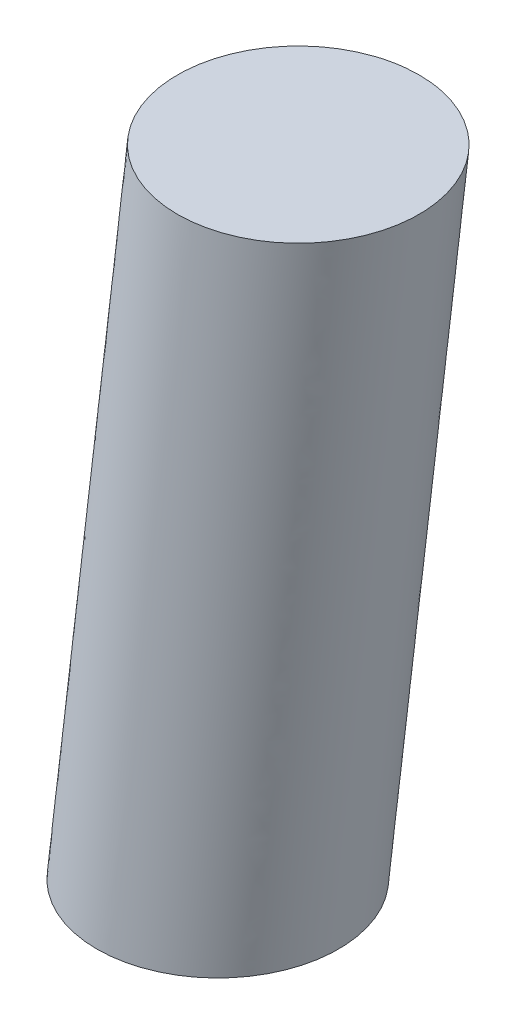
ISO-10303-21;
HEADER;
FILE_DESCRIPTION(('STEP AP214'),'2;1');
FILE_NAME('part.step','',(''),(''),'','','');
FILE_SCHEMA(('AUTOMOTIVE_DESIGN { 1 0 10303 214 1 1 1 1 }'));
ENDSEC;
DATA;
#1=APPLICATION_CONTEXT('core data for automotive mechanical design processes');
#2=APPLICATION_PROTOCOL_DEFINITION('international standard','automotive_design',2000,#1);
#3=PRODUCT_CONTEXT('',#1,'mechanical');
#4=PRODUCT('Part','Part','',(#3));
#5=PRODUCT_RELATED_PRODUCT_CATEGORY('part','',(#4));
#6=PRODUCT_DEFINITION_FORMATION('','',#4);
#7=PRODUCT_DEFINITION_CONTEXT('part definition',#1,'design');
#8=PRODUCT_DEFINITION('design','',#6,#7);
#9=PRODUCT_DEFINITION_SHAPE('','',#8);
#10=(LENGTH_UNIT() NAMED_UNIT(*) SI_UNIT(.MILLI.,.METRE.));
#11=(NAMED_UNIT(*) PLANE_ANGLE_UNIT() SI_UNIT($,.RADIAN.));
#12=(NAMED_UNIT(*) SI_UNIT($,.STERADIAN.) SOLID_ANGLE_UNIT());
#13=UNCERTAINTY_MEASURE_WITH_UNIT(LENGTH_MEASURE(1.E-05),#10,'distance_accuracy_value','');
#14=(GEOMETRIC_REPRESENTATION_CONTEXT(3) GLOBAL_UNCERTAINTY_ASSIGNED_CONTEXT((#13)) GLOBAL_UNIT_ASSIGNED_CONTEXT((#10,
#11,#12)) REPRESENTATION_CONTEXT('',''));
#15=CARTESIAN_POINT('',(0.,0.,0.));
#16=DIRECTION('',(0.,0.,1.));
#17=DIRECTION('',(1.,0.,0.));
#18=AXIS2_PLACEMENT_3D('',#15,#16,#17);
#19=CARTESIAN_POINT('',(75.,0.,0.));
#20=DIRECTION('',(0.,1.,0.));
#21=DIRECTION('',(0.,0.,1.));
#22=AXIS2_PLACEMENT_3D('',#19,#20,#21);
#23=PLANE('',#22);
#24=CARTESIAN_POINT('',(75.,0.,0.));
#25=DIRECTION('',(0.,1.,0.));
#26=DIRECTION('',(0.,0.,1.));
#27=AXIS2_PLACEMENT_3D('',#24,#25,#26);
#28=CIRCLE('',#27,37.5);
#29=CARTESIAN_POINT('',(75.,0.,37.5));
#30=VERTEX_POINT('',#29);
#31=EDGE_CURVE('E37',#30,#30,#28,.T.);
#32=ORIENTED_EDGE('',*,*,#31,.F.);
#33=EDGE_LOOP('',(#32));
#34=FACE_BOUND('',#33,.T.);
#35=ADVANCED_FACE('F31',(#34),#23,.F.);
#36=CARTESIAN_POINT('',(100.,210.,0.));
#37=DIRECTION('',(0.,1.,0.));
#38=DIRECTION('',(0.,0.,1.));
#39=AXIS2_PLACEMENT_3D('',#36,#37,#38);
#40=PLANE('',#39);
#41=CARTESIAN_POINT('',(100.,210.,0.));
#42=DIRECTION('',(0.,1.,0.));
#43=DIRECTION('',(0.,0.,1.));
#44=AXIS2_PLACEMENT_3D('',#41,#42,#43);
#45=CIRCLE('',#44,37.5);
#46=CARTESIAN_POINT('',(100.,210.,37.5));
#47=VERTEX_POINT('',#46);
#48=EDGE_CURVE('E10',#47,#47,#45,.T.);
#49=ORIENTED_EDGE('',*,*,#48,.T.);
#50=EDGE_LOOP('',(#49));
#51=FACE_BOUND('',#50,.T.);
#52=ADVANCED_FACE('F46',(#51),#40,.T.);
#53=CARTESIAN_POINT('',(75.,0.,37.5));
#54=CARTESIAN_POINT('',(100.,210.,37.5));
#55=CARTESIAN_POINT('',(150.,0.,37.5));
#56=CARTESIAN_POINT('',(175.,210.,37.5));
#57=CARTESIAN_POINT('',(150.,0.,-37.5));
#58=CARTESIAN_POINT('',(175.,210.,-37.5));
#59=CARTESIAN_POINT('',(75.,0.,-37.5));
#60=CARTESIAN_POINT('',(100.,210.,-37.5));
#61=CARTESIAN_POINT('',(0.,0.,-37.5));
#62=CARTESIAN_POINT('',(25.,210.,-37.5));
#63=CARTESIAN_POINT('',(0.,0.,37.5));
#64=CARTESIAN_POINT('',(25.,210.,37.5));
#65=CARTESIAN_POINT('',(75.,0.,37.5));
#66=CARTESIAN_POINT('',(100.,210.,37.5));
#67=(BOUNDED_SURFACE() B_SPLINE_SURFACE(3,1,((#53,#54),(#55,#56),(#57,#58),(#59,#60),(#61,#62),
(#63,#64),(#65,#66)),.UNSPECIFIED.,.T.,.F.,.F.) B_SPLINE_SURFACE_WITH_KNOTS((4,3,4),(2,2),(0.,
0.5,1.),(0.,1.),.UNSPECIFIED.) GEOMETRIC_REPRESENTATION_ITEM() RATIONAL_B_SPLINE_SURFACE(((1.,
1.),(0.333333333333333,0.333333333333333),(0.333333333333333,0.333333333333333),(1.,1.),
(0.333333333333333,0.333333333333333),(0.333333333333333,0.333333333333333),(1.,1.))) REPRESENTATION_ITEM('') SURFACE());
#68=CARTESIAN_POINT('',(100.,210.,37.5));
#69=CARTESIAN_POINT('',(99.7395833333333,207.8125,37.5));
#70=CARTESIAN_POINT('',(99.4791666666666,205.625,37.5));
#71=CARTESIAN_POINT('',(98.9583333333333,201.25,37.5));
#72=CARTESIAN_POINT('',(98.6979166666666,199.0625,37.5));
#73=CARTESIAN_POINT('',(98.1770833333333,194.6875,37.5));
#74=CARTESIAN_POINT('',(97.9166666666667,192.5,37.5));
#75=CARTESIAN_POINT('',(97.3958333333333,188.125,37.5));
#76=CARTESIAN_POINT('',(97.1354166666666,185.9375,37.5));
#77=CARTESIAN_POINT('',(96.6145833333333,181.5625,37.5));
#78=CARTESIAN_POINT('',(96.3541666666666,179.375,37.5));
#79=CARTESIAN_POINT('',(95.8333333333333,175.,37.5));
#80=CARTESIAN_POINT('',(95.5729166666667,172.8125,37.5));
#81=CARTESIAN_POINT('',(95.0520833333333,168.4375,37.5));
#82=CARTESIAN_POINT('',(94.7916666666666,166.25,37.5));
#83=CARTESIAN_POINT('',(94.2708333333333,161.875,37.5));
#84=CARTESIAN_POINT('',(94.0104166666667,159.6875,37.5));
#85=CARTESIAN_POINT('',(93.4895833333333,155.3125,37.5));
#86=CARTESIAN_POINT('',(93.2291666666666,153.125,37.5));
#87=CARTESIAN_POINT('',(92.7083333333333,148.75,37.5));
#88=CARTESIAN_POINT('',(92.4479166666666,146.5625,37.5));
#89=CARTESIAN_POINT('',(91.9270833333333,142.1875,37.5));
#90=CARTESIAN_POINT('',(91.6666666666667,140.,37.5));
#91=CARTESIAN_POINT('',(91.1458333333333,135.625,37.5));
#92=CARTESIAN_POINT('',(90.8854166666666,133.4375,37.5));
#93=CARTESIAN_POINT('',(90.3645833333333,129.0625,37.5));
#94=CARTESIAN_POINT('',(90.1041666666667,126.875,37.5));
#95=CARTESIAN_POINT('',(89.5833333333333,122.5,37.5));
#96=CARTESIAN_POINT('',(89.3229166666667,120.3125,37.5));
#97=CARTESIAN_POINT('',(88.8020833333333,115.9375,37.5));
#98=CARTESIAN_POINT('',(88.5416666666667,113.75,37.5));
#99=CARTESIAN_POINT('',(88.0208333333333,109.375,37.5));
#100=CARTESIAN_POINT('',(87.7604166666667,107.1875,37.5));
#101=CARTESIAN_POINT('',(87.2395833333333,102.8125,37.5));
#102=CARTESIAN_POINT('',(86.9791666666666,100.625,37.5));
#103=CARTESIAN_POINT('',(86.4583333333333,96.25,37.5));
#104=CARTESIAN_POINT('',(86.1979166666667,94.0625,37.5));
#105=CARTESIAN_POINT('',(85.6770833333333,89.6875,37.5));
#106=CARTESIAN_POINT('',(85.4166666666667,87.5,37.5));
#107=CARTESIAN_POINT('',(84.8958333333333,83.125,37.5));
#108=CARTESIAN_POINT('',(84.6354166666667,80.9375,37.5));
#109=CARTESIAN_POINT('',(84.1145833333333,76.5625,37.5));
#110=CARTESIAN_POINT('',(83.8541666666667,74.375,37.5));
#111=CARTESIAN_POINT('',(83.3333333333333,70.,37.5));
#112=CARTESIAN_POINT('',(83.0729166666666,67.8125,37.5));
#113=CARTESIAN_POINT('',(82.5520833333333,63.4375,37.5));
#114=CARTESIAN_POINT('',(82.2916666666667,61.25,37.5));
#115=CARTESIAN_POINT('',(81.7708333333333,56.875,37.5));
#116=CARTESIAN_POINT('',(81.5104166666667,54.6875,37.5));
#117=CARTESIAN_POINT('',(80.9895833333333,50.3125,37.5));
#118=CARTESIAN_POINT('',(80.7291666666667,48.125,37.5));
#119=CARTESIAN_POINT('',(80.2083333333333,43.75,37.5));
#120=CARTESIAN_POINT('',(79.9479166666667,41.5625,37.5));
#121=CARTESIAN_POINT('',(79.4270833333333,37.1875,37.5));
#122=CARTESIAN_POINT('',(79.1666666666667,35.,37.5));
#123=CARTESIAN_POINT('',(78.6458333333333,30.625,37.5));
#124=CARTESIAN_POINT('',(78.3854166666667,28.4375,37.5));
#125=CARTESIAN_POINT('',(77.8645833333333,24.0625,37.5));
#126=CARTESIAN_POINT('',(77.6041666666667,21.875,37.5));
#127=CARTESIAN_POINT('',(77.0833333333333,17.5,37.5));
#128=CARTESIAN_POINT('',(76.8229166666667,15.3125,37.5));
#129=CARTESIAN_POINT('',(76.3020833333333,10.9375,37.5));
#130=CARTESIAN_POINT('',(76.0416666666667,8.75,37.5));
#131=CARTESIAN_POINT('',(75.5208333333333,4.375,37.5));
#132=CARTESIAN_POINT('',(75.2604166666666,2.1875,37.5));
#133=CARTESIAN_POINT('',(75.,0.,37.5));
#134=B_SPLINE_CURVE_WITH_KNOTS('',3,(#68,#69,#70,#71,#72,#73,#74,#75,#76,#77,#78,#79,#80,#81,
#82,#83,#84,#85,#86,#87,#88,#89,#90,#91,#92,#93,#94,#95,#96,#97,#98,#99,#100,#101,#102,#103,
#104,#105,#106,#107,#108,#109,#110,#111,#112,#113,#114,#115,#116,#117,#118,#119,#120,#121,#122,
#123,#124,#125,#126,#127,#128,#129,#130,#131,#132,#133),.UNSPECIFIED.,.F.,.F.,(4,2,2,2,2,2,2,2,
2,2,2,2,2,2,2,2,2,2,2,2,2,2,2,2,2,2,2,2,2,2,2,2,4),(0.,6.60883936954894,13.2176787390979,
19.8265181086468,26.4353574781957,33.0441968477447,39.6530362172936,46.2618755868426,
52.8707149563915,59.4795543259404,66.0883936954894,72.6972330650383,79.3060724345873,
85.9149118041362,92.5237511736851,99.1325905432341,105.741429912783,112.350269282332,
118.959108651881,125.56794802143,132.176787390979,138.785626760528,145.394466130077,
152.003305499626,158.612144869174,165.220984238723,171.829823608272,178.438662977821,
185.04750234737,191.656341716919,198.265181086468,204.874020456017,211.482859825566),.UNSPECIFIED.);
#135=EDGE_CURVE('BSEAM43',#47,#30,#134,.T.);
#136=ORIENTED_EDGE('',*,*,#48,.F.);
#137=ORIENTED_EDGE('',*,*,#31,.T.);
#138=ORIENTED_EDGE('',*,*,#135,.T.);
#139=ORIENTED_EDGE('',*,*,#135,.F.);
#140=EDGE_LOOP('',(#136,#138,#137,#139));
#141=FACE_BOUND('',#140,.T.);
#142=ADVANCED_FACE('F43',(#141),#67,.T.);
#143=CLOSED_SHELL('',(#35,#52,#142));
#144=MANIFOLD_SOLID_BREP('B2',#143);
#145=ADVANCED_BREP_SHAPE_REPRESENTATION('',(#18,#144),#14);
#146=SHAPE_DEFINITION_REPRESENTATION(#9,#145);
ENDSEC;
END-ISO-10303-21;
